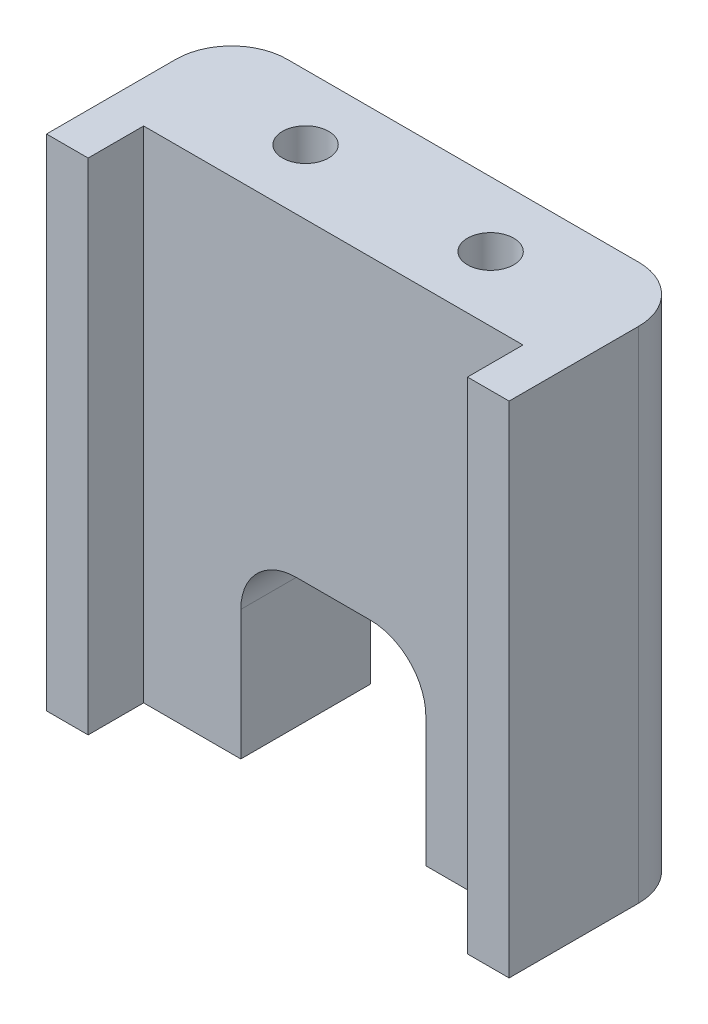
ISO-10303-21;
HEADER;
FILE_DESCRIPTION(('STEP AP214'),'2;1');
FILE_NAME('part.step','',(''),(''),'','','');
FILE_SCHEMA(('AUTOMOTIVE_DESIGN { 1 0 10303 214 1 1 1 1 }'));
ENDSEC;
DATA;
#1=APPLICATION_CONTEXT('core data for automotive mechanical design processes');
#2=APPLICATION_PROTOCOL_DEFINITION('international standard','automotive_design',2000,#1);
#3=PRODUCT_CONTEXT('',#1,'mechanical');
#4=PRODUCT('Part','Part','',(#3));
#5=PRODUCT_RELATED_PRODUCT_CATEGORY('part','',(#4));
#6=PRODUCT_DEFINITION_FORMATION('','',#4);
#7=PRODUCT_DEFINITION_CONTEXT('part definition',#1,'design');
#8=PRODUCT_DEFINITION('design','',#6,#7);
#9=PRODUCT_DEFINITION_SHAPE('','',#8);
#10=(LENGTH_UNIT() NAMED_UNIT(*) SI_UNIT(.MILLI.,.METRE.));
#11=(NAMED_UNIT(*) PLANE_ANGLE_UNIT() SI_UNIT($,.RADIAN.));
#12=(NAMED_UNIT(*) SI_UNIT($,.STERADIAN.) SOLID_ANGLE_UNIT());
#13=UNCERTAINTY_MEASURE_WITH_UNIT(LENGTH_MEASURE(1.E-05),#10,'distance_accuracy_value','');
#14=(GEOMETRIC_REPRESENTATION_CONTEXT(3) GLOBAL_UNCERTAINTY_ASSIGNED_CONTEXT((#13)) GLOBAL_UNIT_ASSIGNED_CONTEXT((#10,
#11,#12)) REPRESENTATION_CONTEXT('',''));
#15=CARTESIAN_POINT('',(0.,0.,0.));
#16=DIRECTION('',(0.,0.,1.));
#17=DIRECTION('',(1.,0.,0.));
#18=AXIS2_PLACEMENT_3D('',#15,#16,#17);
#19=CARTESIAN_POINT('',(0.,0.,10.));
#20=DIRECTION('',(0.,1.,0.));
#21=DIRECTION('',(0.,0.,1.));
#22=AXIS2_PLACEMENT_3D('',#19,#20,#21);
#23=PLANE('',#22);
#24=CARTESIAN_POINT('',(21.5,0.,3.5));
#25=DIRECTION('',(0.,-1.,0.));
#26=DIRECTION('',(0.,0.,-1.));
#27=AXIS2_PLACEMENT_3D('',#24,#25,#26);
#28=CIRCLE('',#27,1.25);
#29=CARTESIAN_POINT('',(21.5,0.,2.25));
#30=VERTEX_POINT('',#29);
#31=EDGE_CURVE('E308',#30,#30,#28,.T.);
#32=ORIENTED_EDGE('',*,*,#31,.F.);
#33=EDGE_LOOP('',(#32));
#34=FACE_BOUND('',#33,.T.);
#35=DIRECTION('',(1.,0.,0.));
#36=VECTOR('',#35,1.);
#37=CARTESIAN_POINT('',(0.,0.,0.));
#38=LINE('',#37,#36);
#39=CARTESIAN_POINT('',(17.5,0.,0.));
#40=VERTEX_POINT('',#39);
#41=CARTESIAN_POINT('',(22.,0.,0.));
#42=VERTEX_POINT('',#41);
#43=EDGE_CURVE('E175',#40,#42,#38,.T.);
#44=ORIENTED_EDGE('',*,*,#43,.T.);
#45=CARTESIAN_POINT('',(22.,0.,3.));
#46=DIRECTION('',(0.,1.,0.));
#47=DIRECTION('',(0.,0.,1.));
#48=AXIS2_PLACEMENT_3D('',#45,#46,#47);
#49=CIRCLE('',#48,3.);
#50=CARTESIAN_POINT('',(25.,0.,3.));
#51=VERTEX_POINT('',#50);
#52=EDGE_CURVE('E61',#42,#51,#49,.F.);
#53=ORIENTED_EDGE('',*,*,#52,.T.);
#54=DIRECTION('',(0.,0.,-1.));
#55=VECTOR('',#54,1.);
#56=CARTESIAN_POINT('',(25.,0.,10.));
#57=LINE('',#56,#55);
#58=CARTESIAN_POINT('',(25.,0.,10.));
#59=VERTEX_POINT('',#58);
#60=EDGE_CURVE('E211',#59,#51,#57,.T.);
#61=ORIENTED_EDGE('',*,*,#60,.F.);
#62=DIRECTION('',(1.,0.,0.));
#63=VECTOR('',#62,1.);
#64=CARTESIAN_POINT('',(0.,0.,10.));
#65=LINE('',#64,#63);
#66=CARTESIAN_POINT('',(22.75,0.,10.));
#67=VERTEX_POINT('',#66);
#68=EDGE_CURVE('E365',#67,#59,#65,.T.);
#69=ORIENTED_EDGE('',*,*,#68,.F.);
#70=DIRECTION('',(0.,0.,1.));
#71=VECTOR('',#70,1.);
#72=CARTESIAN_POINT('',(22.75,0.,7.));
#73=LINE('',#72,#71);
#74=CARTESIAN_POINT('',(22.75,0.,7.));
#75=VERTEX_POINT('',#74);
#76=EDGE_CURVE('E356',#75,#67,#73,.T.);
#77=ORIENTED_EDGE('',*,*,#76,.F.);
#78=DIRECTION('',(1.,0.,0.));
#79=VECTOR('',#78,1.);
#80=CARTESIAN_POINT('',(2.24999999999999,0.,7.));
#81=LINE('',#80,#79);
#82=CARTESIAN_POINT('',(17.5,0.,7.));
#83=VERTEX_POINT('',#82);
#84=EDGE_CURVE('E177',#83,#75,#81,.T.);
#85=ORIENTED_EDGE('',*,*,#84,.F.);
#86=DIRECTION('',(0.,0.,-1.));
#87=VECTOR('',#86,1.);
#88=CARTESIAN_POINT('',(17.5,0.,12.));
#89=LINE('',#88,#87);
#90=EDGE_CURVE('E165',#83,#40,#89,.T.);
#91=ORIENTED_EDGE('',*,*,#90,.T.);
#92=EDGE_LOOP('',(#44,#53,#61,#69,#77,#85,#91));
#93=FACE_BOUND('',#92,.T.);
#94=ADVANCED_FACE('F45',(#34,#93),#23,.F.);
#95=CARTESIAN_POINT('',(0.,0.,10.));
#96=DIRECTION('',(0.,0.,-1.));
#97=DIRECTION('',(-1.,0.,0.));
#98=AXIS2_PLACEMENT_3D('',#95,#96,#97);
#99=PLANE('',#98);
#100=CARTESIAN_POINT('',(0.,0.,10.));
#101=VERTEX_POINT('',#100);
#102=CARTESIAN_POINT('',(2.24999999999999,0.,10.));
#103=VERTEX_POINT('',#102);
#104=EDGE_CURVE('E366',#101,#103,#65,.T.);
#105=ORIENTED_EDGE('',*,*,#104,.T.);
#106=DIRECTION('',(0.,-1.,0.));
#107=VECTOR('',#106,1.);
#108=CARTESIAN_POINT('',(2.25,27.,10.));
#109=LINE('',#108,#107);
#110=CARTESIAN_POINT('',(2.25,27.,10.));
#111=VERTEX_POINT('',#110);
#112=EDGE_CURVE('E319',#111,#103,#109,.T.);
#113=ORIENTED_EDGE('',*,*,#112,.F.);
#114=DIRECTION('',(-1.,0.,0.));
#115=VECTOR('',#114,1.);
#116=CARTESIAN_POINT('',(0.,27.,10.));
#117=LINE('',#116,#115);
#118=CARTESIAN_POINT('',(0.,27.,10.));
#119=VERTEX_POINT('',#118);
#120=EDGE_CURVE('E371',#111,#119,#117,.T.);
#121=ORIENTED_EDGE('',*,*,#120,.T.);
#122=DIRECTION('',(0.,-1.,0.));
#123=VECTOR('',#122,1.);
#124=CARTESIAN_POINT('',(0.,0.,10.));
#125=LINE('',#124,#123);
#126=EDGE_CURVE('E202',#119,#101,#125,.T.);
#127=ORIENTED_EDGE('',*,*,#126,.T.);
#128=EDGE_LOOP('',(#105,#113,#121,#127));
#129=FACE_BOUND('',#128,.T.);
#130=ADVANCED_FACE('F397',(#129),#99,.F.);
#131=CARTESIAN_POINT('',(0.,0.,10.));
#132=DIRECTION('',(1.,0.,0.));
#133=DIRECTION('',(0.,1.,0.));
#134=AXIS2_PLACEMENT_3D('',#131,#132,#133);
#135=PLANE('',#134);
#136=DIRECTION('',(0.,0.,-1.));
#137=VECTOR('',#136,1.);
#138=CARTESIAN_POINT('',(0.,27.,10.));
#139=LINE('',#138,#137);
#140=CARTESIAN_POINT('',(0.,27.,3.));
#141=VERTEX_POINT('',#140);
#142=EDGE_CURVE('E203',#119,#141,#139,.T.);
#143=ORIENTED_EDGE('',*,*,#142,.T.);
#144=DIRECTION('',(0.,-1.,0.));
#145=VECTOR('',#144,1.);
#146=CARTESIAN_POINT('',(0.,0.,3.));
#147=LINE('',#146,#145);
#148=CARTESIAN_POINT('',(0.,0.,3.));
#149=VERTEX_POINT('',#148);
#150=EDGE_CURVE('E240',#141,#149,#147,.T.);
#151=ORIENTED_EDGE('',*,*,#150,.T.);
#152=DIRECTION('',(0.,0.,-1.));
#153=VECTOR('',#152,1.);
#154=CARTESIAN_POINT('',(0.,0.,10.));
#155=LINE('',#154,#153);
#156=EDGE_CURVE('E214',#101,#149,#155,.T.);
#157=ORIENTED_EDGE('',*,*,#156,.F.);
#158=ORIENTED_EDGE('',*,*,#126,.F.);
#159=EDGE_LOOP('',(#143,#151,#157,#158));
#160=FACE_BOUND('',#159,.T.);
#161=ADVANCED_FACE('F408',(#160),#135,.F.);
#162=CARTESIAN_POINT('',(3.5,0.,3.5));
#163=DIRECTION('',(0.,-1.,0.));
#164=DIRECTION('',(0.,0.,-1.));
#165=AXIS2_PLACEMENT_3D('',#162,#163,#164);
#166=CIRCLE('',#165,1.25);
#167=CARTESIAN_POINT('',(3.5,0.,2.25));
#168=VERTEX_POINT('',#167);
#169=EDGE_CURVE('E304',#168,#168,#166,.T.);
#170=ORIENTED_EDGE('',*,*,#169,.F.);
#171=EDGE_LOOP('',(#170));
#172=FACE_BOUND('',#171,.T.);
#173=ORIENTED_EDGE('',*,*,#156,.T.);
#174=CARTESIAN_POINT('',(3.,0.,3.));
#175=DIRECTION('',(0.,1.,0.));
#176=DIRECTION('',(0.,0.,1.));
#177=AXIS2_PLACEMENT_3D('',#174,#175,#176);
#178=CIRCLE('',#177,3.);
#179=CARTESIAN_POINT('',(3.,0.,0.));
#180=VERTEX_POINT('',#179);
#181=EDGE_CURVE('E244',#149,#180,#178,.F.);
#182=ORIENTED_EDGE('',*,*,#181,.T.);
#183=CARTESIAN_POINT('',(7.49999999999999,0.,0.));
#184=VERTEX_POINT('',#183);
#185=EDGE_CURVE('E187',#180,#184,#38,.T.);
#186=ORIENTED_EDGE('',*,*,#185,.T.);
#187=DIRECTION('',(0.,0.,-1.));
#188=VECTOR('',#187,1.);
#189=CARTESIAN_POINT('',(7.49999999999999,0.,12.));
#190=LINE('',#189,#188);
#191=CARTESIAN_POINT('',(7.49999999999999,0.,7.));
#192=VERTEX_POINT('',#191);
#193=EDGE_CURVE('E179',#192,#184,#190,.T.);
#194=ORIENTED_EDGE('',*,*,#193,.F.);
#195=CARTESIAN_POINT('',(2.24999999999999,0.,7.));
#196=VERTEX_POINT('',#195);
#197=EDGE_CURVE('E336',#196,#192,#81,.T.);
#198=ORIENTED_EDGE('',*,*,#197,.F.);
#199=DIRECTION('',(0.,0.,1.));
#200=VECTOR('',#199,1.);
#201=CARTESIAN_POINT('',(2.24999999999999,0.,7.));
#202=LINE('',#201,#200);
#203=EDGE_CURVE('E348',#196,#103,#202,.T.);
#204=ORIENTED_EDGE('',*,*,#203,.T.);
#205=ORIENTED_EDGE('',*,*,#104,.F.);
#206=EDGE_LOOP('',(#173,#182,#186,#194,#198,#204,#205));
#207=FACE_BOUND('',#206,.T.);
#208=ADVANCED_FACE('F401',(#172,#207),#23,.F.);
#209=CARTESIAN_POINT('',(25.,0.,10.));
#210=DIRECTION('',(-1.,0.,0.));
#211=DIRECTION('',(0.,-1.,0.));
#212=AXIS2_PLACEMENT_3D('',#209,#210,#211);
#213=PLANE('',#212);
#214=ORIENTED_EDGE('',*,*,#60,.T.);
#215=DIRECTION('',(0.,1.,0.));
#216=VECTOR('',#215,1.);
#217=CARTESIAN_POINT('',(25.,27.,3.));
#218=LINE('',#217,#216);
#219=CARTESIAN_POINT('',(25.,27.,3.));
#220=VERTEX_POINT('',#219);
#221=EDGE_CURVE('E257',#51,#220,#218,.T.);
#222=ORIENTED_EDGE('',*,*,#221,.T.);
#223=DIRECTION('',(0.,0.,-1.));
#224=VECTOR('',#223,1.);
#225=CARTESIAN_POINT('',(25.,27.,10.));
#226=LINE('',#225,#224);
#227=CARTESIAN_POINT('',(25.,27.,10.));
#228=VERTEX_POINT('',#227);
#229=EDGE_CURVE('E207',#228,#220,#226,.T.);
#230=ORIENTED_EDGE('',*,*,#229,.F.);
#231=DIRECTION('',(0.,1.,0.));
#232=VECTOR('',#231,1.);
#233=CARTESIAN_POINT('',(25.,0.,10.));
#234=LINE('',#233,#232);
#235=EDGE_CURVE('E369',#59,#228,#234,.T.);
#236=ORIENTED_EDGE('',*,*,#235,.F.);
#237=EDGE_LOOP('',(#214,#222,#230,#236));
#238=FACE_BOUND('',#237,.T.);
#239=ADVANCED_FACE('F415',(#238),#213,.F.);
#240=CARTESIAN_POINT('',(0.,27.,10.));
#241=DIRECTION('',(0.,-1.,0.));
#242=DIRECTION('',(0.,0.,-1.));
#243=AXIS2_PLACEMENT_3D('',#240,#241,#242);
#244=PLANE('',#243);
#245=CARTESIAN_POINT('',(7.49999999999999,27.,3.5));
#246=DIRECTION('',(0.,1.,0.));
#247=DIRECTION('',(0.,0.,1.));
#248=AXIS2_PLACEMENT_3D('',#245,#246,#247);
#249=CIRCLE('',#248,1.25);
#250=CARTESIAN_POINT('',(7.49999999999999,27.,4.75));
#251=VERTEX_POINT('',#250);
#252=EDGE_CURVE('E320',#251,#251,#249,.T.);
#253=ORIENTED_EDGE('',*,*,#252,.F.);
#254=EDGE_LOOP('',(#253));
#255=FACE_BOUND('',#254,.T.);
#256=CARTESIAN_POINT('',(17.5,27.,3.5));
#257=DIRECTION('',(0.,1.,0.));
#258=DIRECTION('',(0.,0.,1.));
#259=AXIS2_PLACEMENT_3D('',#256,#257,#258);
#260=CIRCLE('',#259,1.25);
#261=CARTESIAN_POINT('',(17.5,27.,4.75));
#262=VERTEX_POINT('',#261);
#263=EDGE_CURVE('E324',#262,#262,#260,.T.);
#264=ORIENTED_EDGE('',*,*,#263,.F.);
#265=EDGE_LOOP('',(#264));
#266=FACE_BOUND('',#265,.T.);
#267=DIRECTION('',(-1.,0.,0.));
#268=VECTOR('',#267,1.);
#269=CARTESIAN_POINT('',(0.,27.,0.));
#270=LINE('',#269,#268);
#271=CARTESIAN_POINT('',(22.,27.,0.));
#272=VERTEX_POINT('',#271);
#273=CARTESIAN_POINT('',(3.,27.,0.));
#274=VERTEX_POINT('',#273);
#275=EDGE_CURVE('E192',#272,#274,#270,.T.);
#276=ORIENTED_EDGE('',*,*,#275,.T.);
#277=CARTESIAN_POINT('',(3.,27.,3.));
#278=DIRECTION('',(0.,-1.,0.));
#279=DIRECTION('',(0.,0.,-1.));
#280=AXIS2_PLACEMENT_3D('',#277,#278,#279);
#281=CIRCLE('',#280,3.);
#282=EDGE_CURVE('E254',#274,#141,#281,.F.);
#283=ORIENTED_EDGE('',*,*,#282,.T.);
#284=ORIENTED_EDGE('',*,*,#142,.F.);
#285=ORIENTED_EDGE('',*,*,#120,.F.);
#286=DIRECTION('',(0.,0.,1.));
#287=VECTOR('',#286,1.);
#288=CARTESIAN_POINT('',(2.25,27.,7.));
#289=LINE('',#288,#287);
#290=CARTESIAN_POINT('',(2.25,27.,7.));
#291=VERTEX_POINT('',#290);
#292=EDGE_CURVE('E188',#291,#111,#289,.T.);
#293=ORIENTED_EDGE('',*,*,#292,.F.);
#294=DIRECTION('',(-1.,0.,0.));
#295=VECTOR('',#294,1.);
#296=CARTESIAN_POINT('',(2.25,27.,7.));
#297=LINE('',#296,#295);
#298=CARTESIAN_POINT('',(22.75,27.,7.));
#299=VERTEX_POINT('',#298);
#300=EDGE_CURVE('E344',#299,#291,#297,.T.);
#301=ORIENTED_EDGE('',*,*,#300,.F.);
#302=DIRECTION('',(0.,0.,1.));
#303=VECTOR('',#302,1.);
#304=CARTESIAN_POINT('',(22.75,27.,7.));
#305=LINE('',#304,#303);
#306=CARTESIAN_POINT('',(22.75,27.,10.));
#307=VERTEX_POINT('',#306);
#308=EDGE_CURVE('E193',#299,#307,#305,.T.);
#309=ORIENTED_EDGE('',*,*,#308,.T.);
#310=EDGE_CURVE('E197',#228,#307,#117,.T.);
#311=ORIENTED_EDGE('',*,*,#310,.F.);
#312=ORIENTED_EDGE('',*,*,#229,.T.);
#313=CARTESIAN_POINT('',(22.,27.,3.));
#314=DIRECTION('',(0.,-1.,0.));
#315=DIRECTION('',(0.,0.,-1.));
#316=AXIS2_PLACEMENT_3D('',#313,#314,#315);
#317=CIRCLE('',#316,3.);
#318=EDGE_CURVE('E69',#220,#272,#317,.F.);
#319=ORIENTED_EDGE('',*,*,#318,.T.);
#320=EDGE_LOOP('',(#276,#283,#284,#285,#293,#301,#309,#311,#312,#319));
#321=FACE_BOUND('',#320,.T.);
#322=ADVANCED_FACE('F387',(#255,#266,#321),#244,.F.);
#323=ORIENTED_EDGE('',*,*,#310,.T.);
#324=DIRECTION('',(0.,1.,0.));
#325=VECTOR('',#324,1.);
#326=CARTESIAN_POINT('',(22.75,27.,10.));
#327=LINE('',#326,#325);
#328=EDGE_CURVE('E335',#67,#307,#327,.T.);
#329=ORIENTED_EDGE('',*,*,#328,.F.);
#330=ORIENTED_EDGE('',*,*,#68,.T.);
#331=ORIENTED_EDGE('',*,*,#235,.T.);
#332=EDGE_LOOP('',(#323,#329,#330,#331));
#333=FACE_BOUND('',#332,.T.);
#334=ADVANCED_FACE('F384',(#333),#99,.F.);
#335=CARTESIAN_POINT('',(0.,0.,0.));
#336=DIRECTION('',(0.,0.,-1.));
#337=DIRECTION('',(-1.,0.,0.));
#338=AXIS2_PLACEMENT_3D('',#335,#336,#337);
#339=PLANE('',#338);
#340=ORIENTED_EDGE('',*,*,#185,.F.);
#341=DIRECTION('',(0.,-1.,0.));
#342=VECTOR('',#341,1.);
#343=CARTESIAN_POINT('',(3.,27.,0.));
#344=LINE('',#343,#342);
#345=EDGE_CURVE('E249',#180,#274,#344,.F.);
#346=ORIENTED_EDGE('',*,*,#345,.T.);
#347=ORIENTED_EDGE('',*,*,#275,.F.);
#348=DIRECTION('',(0.,1.,0.));
#349=VECTOR('',#348,1.);
#350=CARTESIAN_POINT('',(22.,0.,0.));
#351=LINE('',#350,#349);
#352=EDGE_CURVE('E185',#272,#42,#351,.F.);
#353=ORIENTED_EDGE('',*,*,#352,.T.);
#354=ORIENTED_EDGE('',*,*,#43,.F.);
#355=DIRECTION('',(0.,-1.,0.));
#356=VECTOR('',#355,1.);
#357=CARTESIAN_POINT('',(17.5,0.,0.));
#358=LINE('',#357,#356);
#359=CARTESIAN_POINT('',(17.5,7.,0.));
#360=VERTEX_POINT('',#359);
#361=EDGE_CURVE('E161',#360,#40,#358,.T.);
#362=ORIENTED_EDGE('',*,*,#361,.F.);
#363=CARTESIAN_POINT('',(14.5,7.,0.));
#364=DIRECTION('',(0.,0.,-1.));
#365=DIRECTION('',(-1.,0.,0.));
#366=AXIS2_PLACEMENT_3D('',#363,#364,#365);
#367=CIRCLE('',#366,3.);
#368=CARTESIAN_POINT('',(14.5,10.,0.));
#369=VERTEX_POINT('',#368);
#370=EDGE_CURVE('E54',#360,#369,#367,.F.);
#371=ORIENTED_EDGE('',*,*,#370,.T.);
#372=DIRECTION('',(1.,0.,0.));
#373=VECTOR('',#372,1.);
#374=CARTESIAN_POINT('',(17.5,10.,0.));
#375=LINE('',#374,#373);
#376=CARTESIAN_POINT('',(10.5,10.,0.));
#377=VERTEX_POINT('',#376);
#378=EDGE_CURVE('E180',#377,#369,#375,.T.);
#379=ORIENTED_EDGE('',*,*,#378,.F.);
#380=CARTESIAN_POINT('',(10.5,7.,0.));
#381=DIRECTION('',(0.,0.,-1.));
#382=DIRECTION('',(-1.,0.,0.));
#383=AXIS2_PLACEMENT_3D('',#380,#381,#382);
#384=CIRCLE('',#383,3.);
#385=CARTESIAN_POINT('',(7.49999999999999,7.,0.));
#386=VERTEX_POINT('',#385);
#387=EDGE_CURVE('E262',#377,#386,#384,.F.);
#388=ORIENTED_EDGE('',*,*,#387,.T.);
#389=DIRECTION('',(0.,1.,0.));
#390=VECTOR('',#389,1.);
#391=CARTESIAN_POINT('',(7.49999999999999,0.,0.));
#392=LINE('',#391,#390);
#393=EDGE_CURVE('E172',#184,#386,#392,.T.);
#394=ORIENTED_EDGE('',*,*,#393,.F.);
#395=EDGE_LOOP('',(#340,#346,#347,#353,#354,#362,#371,#379,#388,#394));
#396=FACE_BOUND('',#395,.T.);
#397=ADVANCED_FACE('F183',(#396),#339,.T.);
#398=CARTESIAN_POINT('',(2.25,27.,7.));
#399=DIRECTION('',(-1.,0.,0.));
#400=DIRECTION('',(0.,-1.,0.));
#401=AXIS2_PLACEMENT_3D('',#398,#399,#400);
#402=PLANE('',#401);
#403=ORIENTED_EDGE('',*,*,#112,.T.);
#404=ORIENTED_EDGE('',*,*,#203,.F.);
#405=DIRECTION('',(0.,-1.,0.));
#406=VECTOR('',#405,1.);
#407=CARTESIAN_POINT('',(2.25,27.,7.));
#408=LINE('',#407,#406);
#409=EDGE_CURVE('E331',#291,#196,#408,.T.);
#410=ORIENTED_EDGE('',*,*,#409,.F.);
#411=ORIENTED_EDGE('',*,*,#292,.T.);
#412=EDGE_LOOP('',(#403,#404,#410,#411));
#413=FACE_BOUND('',#412,.T.);
#414=ADVANCED_FACE('F396',(#413),#402,.F.);
#415=CARTESIAN_POINT('',(22.75,27.,7.));
#416=DIRECTION('',(1.,0.,0.));
#417=DIRECTION('',(0.,1.,0.));
#418=AXIS2_PLACEMENT_3D('',#415,#416,#417);
#419=PLANE('',#418);
#420=ORIENTED_EDGE('',*,*,#328,.T.);
#421=ORIENTED_EDGE('',*,*,#308,.F.);
#422=DIRECTION('',(0.,1.,0.));
#423=VECTOR('',#422,1.);
#424=CARTESIAN_POINT('',(22.75,27.,7.));
#425=LINE('',#424,#423);
#426=EDGE_CURVE('E340',#75,#299,#425,.T.);
#427=ORIENTED_EDGE('',*,*,#426,.F.);
#428=ORIENTED_EDGE('',*,*,#76,.T.);
#429=EDGE_LOOP('',(#420,#421,#427,#428));
#430=FACE_BOUND('',#429,.T.);
#431=ADVANCED_FACE('F392',(#430),#419,.F.);
#432=CARTESIAN_POINT('',(0.,0.,7.));
#433=DIRECTION('',(0.,0.,1.));
#434=DIRECTION('',(1.,0.,0.));
#435=AXIS2_PLACEMENT_3D('',#432,#433,#434);
#436=PLANE('',#435);
#437=DIRECTION('',(0.,1.,0.));
#438=VECTOR('',#437,1.);
#439=CARTESIAN_POINT('',(17.5,0.,7.));
#440=LINE('',#439,#438);
#441=CARTESIAN_POINT('',(17.5,7.,7.));
#442=VERTEX_POINT('',#441);
#443=EDGE_CURVE('E225',#83,#442,#440,.T.);
#444=ORIENTED_EDGE('',*,*,#443,.F.);
#445=ORIENTED_EDGE('',*,*,#84,.T.);
#446=ORIENTED_EDGE('',*,*,#426,.T.);
#447=ORIENTED_EDGE('',*,*,#300,.T.);
#448=ORIENTED_EDGE('',*,*,#409,.T.);
#449=ORIENTED_EDGE('',*,*,#197,.T.);
#450=DIRECTION('',(0.,-1.,0.));
#451=VECTOR('',#450,1.);
#452=CARTESIAN_POINT('',(7.49999999999999,0.,7.));
#453=LINE('',#452,#451);
#454=CARTESIAN_POINT('',(7.49999999999999,7.,7.));
#455=VERTEX_POINT('',#454);
#456=EDGE_CURVE('E218',#455,#192,#453,.T.);
#457=ORIENTED_EDGE('',*,*,#456,.F.);
#458=CARTESIAN_POINT('',(10.5,7.,7.));
#459=DIRECTION('',(0.,0.,1.));
#460=DIRECTION('',(1.,0.,0.));
#461=AXIS2_PLACEMENT_3D('',#458,#459,#460);
#462=CIRCLE('',#461,3.);
#463=CARTESIAN_POINT('',(10.5,10.,7.));
#464=VERTEX_POINT('',#463);
#465=EDGE_CURVE('E265',#455,#464,#462,.F.);
#466=ORIENTED_EDGE('',*,*,#465,.T.);
#467=DIRECTION('',(-1.,0.,0.));
#468=VECTOR('',#467,1.);
#469=CARTESIAN_POINT('',(0.,10.,7.));
#470=LINE('',#469,#468);
#471=CARTESIAN_POINT('',(14.5,10.,7.));
#472=VERTEX_POINT('',#471);
#473=EDGE_CURVE('E221',#472,#464,#470,.T.);
#474=ORIENTED_EDGE('',*,*,#473,.F.);
#475=CARTESIAN_POINT('',(14.5,7.,7.));
#476=DIRECTION('',(0.,0.,1.));
#477=DIRECTION('',(1.,0.,0.));
#478=AXIS2_PLACEMENT_3D('',#475,#476,#477);
#479=CIRCLE('',#478,3.);
#480=EDGE_CURVE('E11',#472,#442,#479,.F.);
#481=ORIENTED_EDGE('',*,*,#480,.T.);
#482=EDGE_LOOP('',(#444,#445,#446,#447,#448,#449,#457,#466,#474,#481));
#483=FACE_BOUND('',#482,.T.);
#484=ADVANCED_FACE('F281',(#483),#436,.T.);
#485=CARTESIAN_POINT('',(17.5,15.,3.5));
#486=DIRECTION('',(0.,1.,0.));
#487=DIRECTION('',(0.,0.,1.));
#488=AXIS2_PLACEMENT_3D('',#485,#486,#487);
#489=CYLINDRICAL_SURFACE('',#488,1.25);
#490=CARTESIAN_POINT('',(17.5,15.,3.5));
#491=DIRECTION('',(0.,1.,0.));
#492=DIRECTION('',(0.,0.,1.));
#493=AXIS2_PLACEMENT_3D('',#490,#491,#492);
#494=CIRCLE('',#493,1.25);
#495=CARTESIAN_POINT('',(17.5,15.,4.75));
#496=VERTEX_POINT('',#495);
#497=EDGE_CURVE('E303',#496,#496,#494,.T.);
#498=ORIENTED_EDGE('',*,*,#497,.F.);
#499=EDGE_LOOP('',(#498));
#500=FACE_BOUND('',#499,.T.);
#501=ORIENTED_EDGE('',*,*,#263,.T.);
#502=EDGE_LOOP('',(#501));
#503=FACE_BOUND('',#502,.T.);
#504=ADVANCED_FACE('F442',(#500,#503),#489,.F.);
#505=CARTESIAN_POINT('',(17.5,15.,3.5));
#506=DIRECTION('',(0.,1.,0.));
#507=DIRECTION('',(0.,0.,1.));
#508=AXIS2_PLACEMENT_3D('',#505,#506,#507);
#509=PLANE('',#508);
#510=ORIENTED_EDGE('',*,*,#497,.T.);
#511=EDGE_LOOP('',(#510));
#512=FACE_BOUND('',#511,.T.);
#513=ADVANCED_FACE('F443',(#512),#509,.T.);
#514=CARTESIAN_POINT('',(7.49999999999999,15.,3.5));
#515=DIRECTION('',(0.,1.,0.));
#516=DIRECTION('',(0.,0.,1.));
#517=AXIS2_PLACEMENT_3D('',#514,#515,#516);
#518=CYLINDRICAL_SURFACE('',#517,1.25);
#519=CARTESIAN_POINT('',(7.49999999999999,15.,3.5));
#520=DIRECTION('',(0.,1.,0.));
#521=DIRECTION('',(0.,0.,1.));
#522=AXIS2_PLACEMENT_3D('',#519,#520,#521);
#523=CIRCLE('',#522,1.25);
#524=CARTESIAN_POINT('',(7.49999999999999,15.,4.75));
#525=VERTEX_POINT('',#524);
#526=EDGE_CURVE('E315',#525,#525,#523,.T.);
#527=ORIENTED_EDGE('',*,*,#526,.F.);
#528=EDGE_LOOP('',(#527));
#529=FACE_BOUND('',#528,.T.);
#530=ORIENTED_EDGE('',*,*,#252,.T.);
#531=EDGE_LOOP('',(#530));
#532=FACE_BOUND('',#531,.T.);
#533=ADVANCED_FACE('F446',(#529,#532),#518,.F.);
#534=CARTESIAN_POINT('',(7.49999999999999,15.,3.5));
#535=DIRECTION('',(0.,1.,0.));
#536=DIRECTION('',(0.,0.,1.));
#537=AXIS2_PLACEMENT_3D('',#534,#535,#536);
#538=PLANE('',#537);
#539=ORIENTED_EDGE('',*,*,#526,.T.);
#540=EDGE_LOOP('',(#539));
#541=FACE_BOUND('',#540,.T.);
#542=ADVANCED_FACE('F453',(#541),#538,.T.);
#543=CARTESIAN_POINT('',(21.5,12.,3.5));
#544=DIRECTION('',(0.,-1.,0.));
#545=DIRECTION('',(0.,0.,-1.));
#546=AXIS2_PLACEMENT_3D('',#543,#544,#545);
#547=CYLINDRICAL_SURFACE('',#546,1.25);
#548=CARTESIAN_POINT('',(21.5,12.,3.5));
#549=DIRECTION('',(0.,-1.,0.));
#550=DIRECTION('',(0.,0.,-1.));
#551=AXIS2_PLACEMENT_3D('',#548,#549,#550);
#552=CIRCLE('',#551,1.25);
#553=CARTESIAN_POINT('',(21.5,12.,2.25));
#554=VERTEX_POINT('',#553);
#555=EDGE_CURVE('E297',#554,#554,#552,.T.);
#556=ORIENTED_EDGE('',*,*,#555,.F.);
#557=EDGE_LOOP('',(#556));
#558=FACE_BOUND('',#557,.T.);
#559=ORIENTED_EDGE('',*,*,#31,.T.);
#560=EDGE_LOOP('',(#559));
#561=FACE_BOUND('',#560,.T.);
#562=ADVANCED_FACE('F457',(#558,#561),#547,.F.);
#563=CARTESIAN_POINT('',(21.5,12.,3.5));
#564=DIRECTION('',(0.,-1.,0.));
#565=DIRECTION('',(0.,0.,-1.));
#566=AXIS2_PLACEMENT_3D('',#563,#564,#565);
#567=PLANE('',#566);
#568=ORIENTED_EDGE('',*,*,#555,.T.);
#569=EDGE_LOOP('',(#568));
#570=FACE_BOUND('',#569,.T.);
#571=ADVANCED_FACE('F459',(#570),#567,.T.);
#572=CARTESIAN_POINT('',(3.5,12.,3.5));
#573=DIRECTION('',(0.,-1.,0.));
#574=DIRECTION('',(0.,0.,-1.));
#575=AXIS2_PLACEMENT_3D('',#572,#573,#574);
#576=CYLINDRICAL_SURFACE('',#575,1.25);
#577=CARTESIAN_POINT('',(3.5,12.,3.5));
#578=DIRECTION('',(0.,-1.,0.));
#579=DIRECTION('',(0.,0.,-1.));
#580=AXIS2_PLACEMENT_3D('',#577,#578,#579);
#581=CIRCLE('',#580,1.25);
#582=CARTESIAN_POINT('',(3.5,12.,2.25));
#583=VERTEX_POINT('',#582);
#584=EDGE_CURVE('E299',#583,#583,#581,.T.);
#585=ORIENTED_EDGE('',*,*,#584,.F.);
#586=EDGE_LOOP('',(#585));
#587=FACE_BOUND('',#586,.T.);
#588=ORIENTED_EDGE('',*,*,#169,.T.);
#589=EDGE_LOOP('',(#588));
#590=FACE_BOUND('',#589,.T.);
#591=ADVANCED_FACE('F462',(#587,#590),#576,.F.);
#592=CARTESIAN_POINT('',(3.5,12.,3.5));
#593=DIRECTION('',(0.,-1.,0.));
#594=DIRECTION('',(0.,0.,-1.));
#595=AXIS2_PLACEMENT_3D('',#592,#593,#594);
#596=PLANE('',#595);
#597=ORIENTED_EDGE('',*,*,#584,.T.);
#598=EDGE_LOOP('',(#597));
#599=FACE_BOUND('',#598,.T.);
#600=ADVANCED_FACE('F469',(#599),#596,.T.);
#601=CARTESIAN_POINT('',(17.5,0.,12.));
#602=DIRECTION('',(1.,0.,0.));
#603=DIRECTION('',(0.,1.,0.));
#604=AXIS2_PLACEMENT_3D('',#601,#602,#603);
#605=PLANE('',#604);
#606=ORIENTED_EDGE('',*,*,#443,.T.);
#607=DIRECTION('',(0.,0.,-1.));
#608=VECTOR('',#607,1.);
#609=CARTESIAN_POINT('',(17.5,7.,0.));
#610=LINE('',#609,#608);
#611=EDGE_CURVE('E168',#442,#360,#610,.T.);
#612=ORIENTED_EDGE('',*,*,#611,.T.);
#613=ORIENTED_EDGE('',*,*,#361,.T.);
#614=ORIENTED_EDGE('',*,*,#90,.F.);
#615=EDGE_LOOP('',(#606,#612,#613,#614));
#616=FACE_BOUND('',#615,.T.);
#617=ADVANCED_FACE('F164',(#616),#605,.F.);
#618=CARTESIAN_POINT('',(17.5,10.,12.));
#619=DIRECTION('',(0.,1.,0.));
#620=DIRECTION('',(0.,0.,1.));
#621=AXIS2_PLACEMENT_3D('',#618,#619,#620);
#622=PLANE('',#621);
#623=ORIENTED_EDGE('',*,*,#473,.T.);
#624=DIRECTION('',(0.,0.,-1.));
#625=VECTOR('',#624,1.);
#626=CARTESIAN_POINT('',(10.5,10.,0.));
#627=LINE('',#626,#625);
#628=EDGE_CURVE('E231',#464,#377,#627,.T.);
#629=ORIENTED_EDGE('',*,*,#628,.T.);
#630=ORIENTED_EDGE('',*,*,#378,.T.);
#631=DIRECTION('',(0.,0.,-1.));
#632=VECTOR('',#631,1.);
#633=CARTESIAN_POINT('',(14.5,10.,7.));
#634=LINE('',#633,#632);
#635=EDGE_CURVE('E228',#369,#472,#634,.F.);
#636=ORIENTED_EDGE('',*,*,#635,.T.);
#637=EDGE_LOOP('',(#623,#629,#630,#636));
#638=FACE_BOUND('',#637,.T.);
#639=ADVANCED_FACE('F273',(#638),#622,.F.);
#640=CARTESIAN_POINT('',(7.49999999999999,0.,12.));
#641=DIRECTION('',(-1.,0.,0.));
#642=DIRECTION('',(0.,-1.,0.));
#643=AXIS2_PLACEMENT_3D('',#640,#641,#642);
#644=PLANE('',#643);
#645=ORIENTED_EDGE('',*,*,#393,.T.);
#646=DIRECTION('',(0.,0.,-1.));
#647=VECTOR('',#646,1.);
#648=CARTESIAN_POINT('',(7.49999999999999,7.,7.));
#649=LINE('',#648,#647);
#650=EDGE_CURVE('E235',#386,#455,#649,.F.);
#651=ORIENTED_EDGE('',*,*,#650,.T.);
#652=ORIENTED_EDGE('',*,*,#456,.T.);
#653=ORIENTED_EDGE('',*,*,#193,.T.);
#654=EDGE_LOOP('',(#645,#651,#652,#653));
#655=FACE_BOUND('',#654,.T.);
#656=ADVANCED_FACE('F291',(#655),#644,.F.);
#657=CARTESIAN_POINT('',(10.5,7.,12.));
#658=DIRECTION('',(0.,0.,1.));
#659=DIRECTION('',(1.,0.,0.));
#660=AXIS2_PLACEMENT_3D('',#657,#658,#659);
#661=CYLINDRICAL_SURFACE('',#660,3.);
#662=ORIENTED_EDGE('',*,*,#465,.F.);
#663=ORIENTED_EDGE('',*,*,#650,.F.);
#664=ORIENTED_EDGE('',*,*,#387,.F.);
#665=ORIENTED_EDGE('',*,*,#628,.F.);
#666=EDGE_LOOP('',(#662,#663,#664,#665));
#667=FACE_BOUND('',#666,.T.);
#668=ADVANCED_FACE('F285',(#667),#661,.F.);
#669=CARTESIAN_POINT('',(14.5,7.,12.));
#670=DIRECTION('',(0.,0.,1.));
#671=DIRECTION('',(1.,0.,0.));
#672=AXIS2_PLACEMENT_3D('',#669,#670,#671);
#673=CYLINDRICAL_SURFACE('',#672,3.);
#674=ORIENTED_EDGE('',*,*,#480,.F.);
#675=ORIENTED_EDGE('',*,*,#635,.F.);
#676=ORIENTED_EDGE('',*,*,#370,.F.);
#677=ORIENTED_EDGE('',*,*,#611,.F.);
#678=EDGE_LOOP('',(#674,#675,#676,#677));
#679=FACE_BOUND('',#678,.T.);
#680=ADVANCED_FACE('F279',(#679),#673,.F.);
#681=CARTESIAN_POINT('',(3.,0.,3.));
#682=DIRECTION('',(0.,1.,0.));
#683=DIRECTION('',(-1.,0.,0.));
#684=AXIS2_PLACEMENT_3D('',#681,#682,#683);
#685=CYLINDRICAL_SURFACE('',#684,3.);
#686=ORIENTED_EDGE('',*,*,#282,.F.);
#687=ORIENTED_EDGE('',*,*,#345,.F.);
#688=ORIENTED_EDGE('',*,*,#181,.F.);
#689=ORIENTED_EDGE('',*,*,#150,.F.);
#690=EDGE_LOOP('',(#686,#687,#688,#689));
#691=FACE_BOUND('',#690,.T.);
#692=ADVANCED_FACE('F405',(#691),#685,.T.);
#693=CARTESIAN_POINT('',(22.,0.,3.));
#694=DIRECTION('',(0.,-1.,0.));
#695=DIRECTION('',(1.,0.,0.));
#696=AXIS2_PLACEMENT_3D('',#693,#694,#695);
#697=CYLINDRICAL_SURFACE('',#696,3.);
#698=ORIENTED_EDGE('',*,*,#52,.F.);
#699=ORIENTED_EDGE('',*,*,#352,.F.);
#700=ORIENTED_EDGE('',*,*,#318,.F.);
#701=ORIENTED_EDGE('',*,*,#221,.F.);
#702=EDGE_LOOP('',(#698,#699,#700,#701));
#703=FACE_BOUND('',#702,.T.);
#704=ADVANCED_FACE('F47',(#703),#697,.T.);
#705=CLOSED_SHELL('',(#94,#130,#161,#208,#239,#322,#334,#397,#414,#431,#484,#504,#513,#533,#542,
#562,#571,#591,#600,#617,#639,#656,#668,#680,#692,#704));
#706=MANIFOLD_SOLID_BREP('B2',#705);
#707=ADVANCED_BREP_SHAPE_REPRESENTATION('',(#18,#706),#14);
#708=SHAPE_DEFINITION_REPRESENTATION(#9,#707);
ENDSEC;
END-ISO-10303-21;
